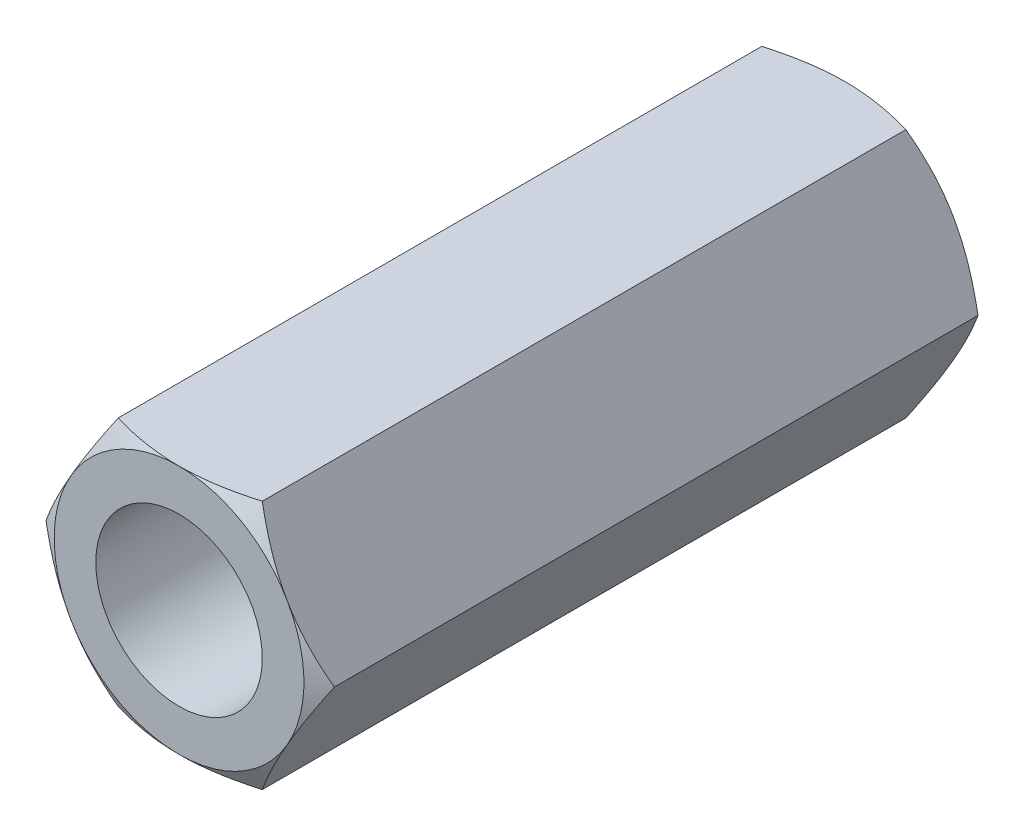
ISO-10303-21;
HEADER;
FILE_DESCRIPTION(('STEP AP214'),'2;1');
FILE_NAME('part.step','',(''),(''),'','','');
FILE_SCHEMA(('AUTOMOTIVE_DESIGN { 1 0 10303 214 1 1 1 1 }'));
ENDSEC;
DATA;
#1=APPLICATION_CONTEXT('core data for automotive mechanical design processes');
#2=APPLICATION_PROTOCOL_DEFINITION('international standard','automotive_design',2000,#1);
#3=PRODUCT_CONTEXT('',#1,'mechanical');
#4=PRODUCT('Part','Part','',(#3));
#5=PRODUCT_RELATED_PRODUCT_CATEGORY('part','',(#4));
#6=PRODUCT_DEFINITION_FORMATION('','',#4);
#7=PRODUCT_DEFINITION_CONTEXT('part definition',#1,'design');
#8=PRODUCT_DEFINITION('design','',#6,#7);
#9=PRODUCT_DEFINITION_SHAPE('','',#8);
#10=(LENGTH_UNIT() NAMED_UNIT(*) SI_UNIT(.MILLI.,.METRE.));
#11=(NAMED_UNIT(*) PLANE_ANGLE_UNIT() SI_UNIT($,.RADIAN.));
#12=(NAMED_UNIT(*) SI_UNIT($,.STERADIAN.) SOLID_ANGLE_UNIT());
#13=UNCERTAINTY_MEASURE_WITH_UNIT(LENGTH_MEASURE(1.E-05),#10,'distance_accuracy_value','');
#14=(GEOMETRIC_REPRESENTATION_CONTEXT(3) GLOBAL_UNCERTAINTY_ASSIGNED_CONTEXT((#13)) GLOBAL_UNIT_ASSIGNED_CONTEXT((#10,
#11,#12)) REPRESENTATION_CONTEXT('',''));
#15=CARTESIAN_POINT('',(0.,0.,0.));
#16=DIRECTION('',(0.,0.,1.));
#17=DIRECTION('',(1.,0.,0.));
#18=AXIS2_PLACEMENT_3D('',#15,#16,#17);
#19=CARTESIAN_POINT('',(0.,0.,7.56698729810778));
#20=DIRECTION('',(0.,0.,-1.));
#21=DIRECTION('',(0.,1.,0.));
#22=AXIS2_PLACEMENT_3D('',#19,#20,#21);
#23=CONICAL_SURFACE('',#22,3.75,1.0471975511966);
#24=CARTESIAN_POINT('',(-4.61658816560314,-3.,6.55332536641131));
#25=CARTESIAN_POINT('',(-4.48585639553745,-3.,6.61659673599051));
#26=CARTESIAN_POINT('',(-4.35482063299639,-3.,6.67925095047082));
#27=CARTESIAN_POINT('',(-4.09197932362655,-3.,6.80297722697862));
#28=CARTESIAN_POINT('',(-3.96017365610343,-3.,6.86404903231273));
#29=CARTESIAN_POINT('',(-3.69493421662757,-3.,6.98457763911744));
#30=CARTESIAN_POINT('',(-3.56149546306723,-3.,7.04402351646837));
#31=CARTESIAN_POINT('',(-3.29354397999658,-3.,7.16043407504241));
#32=CARTESIAN_POINT('',(-3.15903130268234,-3.,7.21739887599533));
#33=CARTESIAN_POINT('',(-2.88451486663867,-3.,7.32991377331615));
#34=CARTESIAN_POINT('',(-2.74447033709531,-3.,7.38536494839728));
#35=CARTESIAN_POINT('',(-2.46272959449536,-3.,7.49198287179878));
#36=CARTESIAN_POINT('',(-2.32103319621333,-3.,7.54314913428037));
#37=CARTESIAN_POINT('',(-2.03604039609872,-3.,7.63982761977302));
#38=CARTESIAN_POINT('',(-1.89274802630187,-3.,7.68535160726105));
#39=CARTESIAN_POINT('',(-1.60410836835444,-3.,7.76926106967255));
#40=CARTESIAN_POINT('',(-1.4587617546537,-3.,7.8076488315534));
#41=CARTESIAN_POINT('',(-1.16673215848061,-3.,7.8752176455911));
#42=CARTESIAN_POINT('',(-1.0200606408196,-3.,7.90444732518244));
#43=CARTESIAN_POINT('',(-0.724931883390046,-3.,7.95202353955565));
#44=CARTESIAN_POINT('',(-0.57647480215395,-3.,7.97037103334759));
#45=CARTESIAN_POINT('',(-0.280440052185821,-3.,7.99447833561648));
#46=CARTESIAN_POINT('',(-0.132875652708779,-3.,8.00039709755714));
#47=CARTESIAN_POINT('',(0.162228239904157,-3.,7.99956145014694));
#48=CARTESIAN_POINT('',(0.309767732325291,-3.,7.99280672401251));
#49=CARTESIAN_POINT('',(0.561328059626861,-3.,7.9709572819287));
#50=CARTESIAN_POINT('',(0.665621803419396,-3.,7.95883150506769));
#51=CARTESIAN_POINT('',(0.873419518980608,-3.,7.92902216036775));
#52=CARTESIAN_POINT('',(0.976923376822562,-3.,7.91133780576261));
#53=CARTESIAN_POINT('',(1.28611373532514,-3.,7.85087645938643));
#54=CARTESIAN_POINT('',(1.49035730083079,-3.,7.80070312750081));
#55=CARTESIAN_POINT('',(1.89902764143582,-3.,7.68479281504696));
#56=CARTESIAN_POINT('',(2.10336150492194,-3.,7.61874063547991));
#57=CARTESIAN_POINT('',(2.40703442855808,-3.,7.51188270244431));
#58=CARTESIAN_POINT('',(2.50777604457203,-3.,7.47497145514699));
#59=CARTESIAN_POINT('',(2.70843244292279,-3.,7.39896563915211));
#60=CARTESIAN_POINT('',(2.80834723318006,-3.,7.35987109139702));
#61=CARTESIAN_POINT('',(3.03652654486057,-3.,7.26818150264062));
#62=CARTESIAN_POINT('',(3.16454614650238,-3.,7.21497889029494));
#63=CARTESIAN_POINT('',(3.4195550326144,-3.,7.10615379179428));
#64=CARTESIAN_POINT('',(3.54654426752982,-3.,7.05053119006049));
#65=CARTESIAN_POINT('',(3.9262586042304,-3.,6.88075275505402));
#66=CARTESIAN_POINT('',(4.17768851165821,-3.,6.76370348434465));
#67=CARTESIAN_POINT('',(4.67831517527856,-3.,6.52440154372504));
#68=CARTESIAN_POINT('',(4.92750969345665,-3.,6.40214424003166));
#69=CARTESIAN_POINT('',(5.42413001849476,-3.,6.15407673717374));
#70=CARTESIAN_POINT('',(5.67155576558937,-3.,6.02826641865999));
#71=CARTESIAN_POINT('',(6.14562883300115,-3.,5.78413020470004));
#72=CARTESIAN_POINT('',(6.3723756003469,-3.,5.66599677644138));
#73=CARTESIAN_POINT('',(6.82501767517009,-3.,5.42809509619585));
#74=CARTESIAN_POINT('',(7.05091295673014,-3.,5.30832679495164));
#75=CARTESIAN_POINT('',(7.50152538445931,-3.,5.06780728554477));
#76=CARTESIAN_POINT('',(7.72624403806942,-3.,4.94705889743175));
#77=CARTESIAN_POINT('',(8.17513206085803,-3.,4.70457171012414));
#78=CARTESIAN_POINT('',(8.3993014569565,-3.,4.58283296078537));
#79=CARTESIAN_POINT('',(8.62326645922437,-3.,4.46072192935785));
#80=B_SPLINE_CURVE_WITH_KNOTS('',3,(#24,#25,#26,#27,#28,#29,#30,#31,#32,#33,#34,#35,#36,#37,#38,
#39,#40,#41,#42,#43,#44,#45,#46,#47,#48,#49,#50,#51,#52,#53,#54,#55,#56,#57,#58,#59,#60,#61,#62,
#63,#64,#65,#66,#67,#68,#69,#70,#71,#72,#73,#74,#75,#76,#77,#78,#79),.UNSPECIFIED.,.F.,.F.,(4,2,
2,2,2,2,2,2,2,2,2,2,2,2,2,2,2,2,2,2,2,2,2,2,2,2,2,4),(0.,0.435719350665182,0.871508945355478,
1.30973230306221,1.74793448985021,2.19974947235604,2.65161561410331,3.10252314515071,
3.55328592310448,4.00161301376219,4.4499005890032,4.8924191110649,5.33494869436421,
5.64978531479407,5.96466651757124,6.59479413668654,7.2386470362871,7.56049974594028,
7.88234936887596,8.29822097415706,8.71411246333824,9.54603104088751,10.3787059339167,
11.2114088306492,11.9784254401204,12.7454652103875,13.5107780415065,14.2760525814872),.UNSPECIFIED.);
#81=CARTESIAN_POINT('',(1.73205080756888,-3.,7.73205080756888));
#82=VERTEX_POINT('',#81);
#83=CARTESIAN_POINT('',(0.,-3.,8.));
#84=VERTEX_POINT('',#83);
#85=EDGE_CURVE('E227',#82,#84,#80,.F.);
#86=ORIENTED_EDGE('',*,*,#85,.F.);
#87=CARTESIAN_POINT('',(3.46421708519159,0.000199999999999775,7.73198413756899));
#88=CARTESIAN_POINT('',(3.38810199317915,-0.131635206588333,7.77594629554769));
#89=CARTESIAN_POINT('',(3.31132988107606,-0.26460840535525,7.81592841370737));
#90=CARTESIAN_POINT('',(3.15645624025988,-0.532857420002057,7.88571791955454));
#91=CARTESIAN_POINT('',(3.078351959461,-0.668138002634343,7.91550061773462));
#92=CARTESIAN_POINT('',(2.92311136358059,-0.937022602096485,7.96186216078875));
#93=CARTESIAN_POINT('',(2.84599893549861,-1.07058524542946,7.97874955887705));
#94=CARTESIAN_POINT('',(2.6914112001411,-1.33833905729569,7.99891035755148));
#95=CARTESIAN_POINT('',(2.61393645482892,-1.47252925247985,8.00220045221892));
#96=CARTESIAN_POINT('',(2.46916798492017,-1.72327559769581,7.99535946911461));
#97=CARTESIAN_POINT('',(2.40185259973206,-1.83986926497268,7.98690808580738));
#98=CARTESIAN_POINT('',(2.2676603930218,-2.07229698497464,7.96012105699297));
#99=CARTESIAN_POINT('',(2.2007840357172,-2.18813023365133,7.94177625913829));
#100=CARTESIAN_POINT('',(2.06631510305815,-2.42103725705637,7.89591524914667));
#101=CARTESIAN_POINT('',(1.99873954872331,-2.53808155051394,7.86820461473692));
#102=CARTESIAN_POINT('',(1.86459637060759,-2.77042435049913,7.8053122048626));
#103=CARTESIAN_POINT('',(1.79802702797161,-2.88572583417111,7.77014520897844));
#104=CARTESIAN_POINT('',(1.73193533751504,-3.0002,7.73198413756899));
#105=B_SPLINE_CURVE_WITH_KNOTS('',3,(#87,#88,#89,#90,#91,#92,#93,#94,#95,#96,#97,#98,#99,#100,
#101,#102,#103,#104),.UNSPECIFIED.,.F.,.F.,(4,2,2,2,2,2,2,2,4),(0.,0.475539830103042,
0.952222784107966,1.41710776961288,1.88142182298026,2.28572436316091,2.69040156475039,
3.10405572063576,3.5168974940707),.UNSPECIFIED.);
#106=CARTESIAN_POINT('',(2.59807621135331,-1.5,8.));
#107=VERTEX_POINT('',#106);
#108=EDGE_CURVE('E156',#107,#82,#105,.T.);
#109=ORIENTED_EDGE('',*,*,#108,.F.);
#110=CARTESIAN_POINT('',(0.,0.,8.));
#111=DIRECTION('',(0.,0.,1.));
#112=DIRECTION('',(0.,-1.,0.));
#113=AXIS2_PLACEMENT_3D('',#110,#111,#112);
#114=CIRCLE('',#113,3.);
#115=EDGE_CURVE('E12',#84,#107,#114,.T.);
#116=ORIENTED_EDGE('',*,*,#115,.F.);
#117=EDGE_LOOP('',(#86,#109,#116));
#118=FACE_BOUND('',#117,.T.);
#119=ADVANCED_FACE('F37',(#118),#23,.T.);
#120=CARTESIAN_POINT('',(-1.73205080756888,-3.,7.73205080756888));
#121=VERTEX_POINT('',#120);
#122=EDGE_CURVE('E232',#84,#121,#80,.F.);
#123=ORIENTED_EDGE('',*,*,#122,.F.);
#124=CARTESIAN_POINT('',(-2.59807621135332,-1.5,8.));
#125=VERTEX_POINT('',#124);
#126=EDGE_CURVE('E46',#125,#84,#114,.T.);
#127=ORIENTED_EDGE('',*,*,#126,.F.);
#128=CARTESIAN_POINT('',(-1.73193533751504,-3.0002,7.73198413756899));
#129=CARTESIAN_POINT('',(-1.80805042952748,-2.86836479341167,7.77594629554769));
#130=CARTESIAN_POINT('',(-1.88482254163057,-2.73539159464475,7.81592841370737));
#131=CARTESIAN_POINT('',(-2.03969618244675,-2.46714257999794,7.88571791955454));
#132=CARTESIAN_POINT('',(-2.11780046324563,-2.33186199736566,7.91550061773462));
#133=CARTESIAN_POINT('',(-2.27304105912605,-2.06297739790352,7.96186216078875));
#134=CARTESIAN_POINT('',(-2.35015348720802,-1.92941475457054,7.97874955887705));
#135=CARTESIAN_POINT('',(-2.50474122256554,-1.66166094270431,7.99891035755148));
#136=CARTESIAN_POINT('',(-2.58221596787771,-1.52747074752016,8.00220045221892));
#137=CARTESIAN_POINT('',(-2.72698443778647,-1.27672440230419,7.99535946911461));
#138=CARTESIAN_POINT('',(-2.79429982297457,-1.16013073502732,7.98690808580738));
#139=CARTESIAN_POINT('',(-2.92849202968483,-0.927703015025363,7.96012105699297));
#140=CARTESIAN_POINT('',(-2.99536838698943,-0.811869766348669,7.94177625913829));
#141=CARTESIAN_POINT('',(-3.12983731964849,-0.578962742943632,7.89591524914667));
#142=CARTESIAN_POINT('',(-3.19741287398332,-0.461918449486059,7.86820461473692));
#143=CARTESIAN_POINT('',(-3.33155605209904,-0.229575649500875,7.8053122048626));
#144=CARTESIAN_POINT('',(-3.39812539473502,-0.114274165828894,7.77014520897844));
#145=CARTESIAN_POINT('',(-3.46421708519159,0.00019999999999953,7.73198413756899));
#146=B_SPLINE_CURVE_WITH_KNOTS('',3,(#128,#129,#130,#131,#132,#133,#134,#135,#136,#137,#138,
#139,#140,#141,#142,#143,#144,#145),.UNSPECIFIED.,.F.,.F.,(4,2,2,2,2,2,2,2,4),(0.,
0.475539830103042,0.952222784107965,1.41710776961288,1.88142182298026,2.28572436316091,
2.69040156475039,3.10405572063576,3.5168974940707),.UNSPECIFIED.);
#147=EDGE_CURVE('E273',#121,#125,#146,.T.);
#148=ORIENTED_EDGE('',*,*,#147,.F.);
#149=EDGE_LOOP('',(#123,#127,#148));
#150=FACE_BOUND('',#149,.T.);
#151=ADVANCED_FACE('F248',(#150),#23,.T.);
#152=CARTESIAN_POINT('',(-3.46410161513775,0.,7.73205080756888));
#153=VERTEX_POINT('',#152);
#154=EDGE_CURVE('E268',#125,#153,#146,.T.);
#155=ORIENTED_EDGE('',*,*,#154,.F.);
#156=CARTESIAN_POINT('',(-2.59807621135332,1.5,8.));
#157=VERTEX_POINT('',#156);
#158=EDGE_CURVE('E223',#157,#125,#114,.T.);
#159=ORIENTED_EDGE('',*,*,#158,.F.);
#160=CARTESIAN_POINT('',(-3.46421708519159,-0.000200000000000177,7.73198413756899));
#161=CARTESIAN_POINT('',(-3.38810199317915,0.131635206588331,7.77594629554769));
#162=CARTESIAN_POINT('',(-3.31132988107606,0.264608405355249,7.81592841370737));
#163=CARTESIAN_POINT('',(-3.15645624025988,0.532857420002056,7.88571791955453));
#164=CARTESIAN_POINT('',(-3.078351959461,0.668138002634342,7.91550061773462));
#165=CARTESIAN_POINT('',(-2.92311136358059,0.937022602096484,7.96186216078874));
#166=CARTESIAN_POINT('',(-2.84599893549861,1.07058524542946,7.97874955887705));
#167=CARTESIAN_POINT('',(-2.6914112001411,1.33833905729569,7.99891035755148));
#168=CARTESIAN_POINT('',(-2.61393645482892,1.47252925247985,8.00220045221892));
#169=CARTESIAN_POINT('',(-2.46916798492017,1.72327559769581,7.99535946911461));
#170=CARTESIAN_POINT('',(-2.40185259973206,1.83986926497268,7.98690808580738));
#171=CARTESIAN_POINT('',(-2.2676603930218,2.07229698497464,7.96012105699296));
#172=CARTESIAN_POINT('',(-2.2007840357172,2.18813023365133,7.94177625913829));
#173=CARTESIAN_POINT('',(-2.06631510305815,2.42103725705637,7.89591524914667));
#174=CARTESIAN_POINT('',(-1.99873954872331,2.53808155051394,7.86820461473692));
#175=CARTESIAN_POINT('',(-1.86459637060759,2.77042435049913,7.8053122048626));
#176=CARTESIAN_POINT('',(-1.79802702797161,2.88572583417111,7.77014520897844));
#177=CARTESIAN_POINT('',(-1.73193533751504,3.0002,7.73198413756899));
#178=B_SPLINE_CURVE_WITH_KNOTS('',3,(#160,#161,#162,#163,#164,#165,#166,#167,#168,#169,#170,
#171,#172,#173,#174,#175,#176,#177),.UNSPECIFIED.,.F.,.F.,(4,2,2,2,2,2,2,2,4),(0.,
0.47553983010304,0.952222784107965,1.41710776961288,1.88142182298026,2.28572436316091,
2.69040156475039,3.10405572063576,3.5168974940707),.UNSPECIFIED.);
#179=EDGE_CURVE('E334',#153,#157,#178,.T.);
#180=ORIENTED_EDGE('',*,*,#179,.F.);
#181=EDGE_LOOP('',(#155,#159,#180));
#182=FACE_BOUND('',#181,.T.);
#183=ADVANCED_FACE('F333',(#182),#23,.T.);
#184=CARTESIAN_POINT('',(-1.73205080756888,3.,7.73205080756888));
#185=VERTEX_POINT('',#184);
#186=EDGE_CURVE('E263',#157,#185,#178,.T.);
#187=ORIENTED_EDGE('',*,*,#186,.F.);
#188=CARTESIAN_POINT('',(0.,3.,8.));
#189=VERTEX_POINT('',#188);
#190=EDGE_CURVE('E322',#189,#157,#114,.T.);
#191=ORIENTED_EDGE('',*,*,#190,.F.);
#192=CARTESIAN_POINT('',(-4.61658816560314,3.,6.55332536641131));
#193=CARTESIAN_POINT('',(-4.48585639553746,3.,6.61659673599051));
#194=CARTESIAN_POINT('',(-4.35482063299639,3.,6.67925095047082));
#195=CARTESIAN_POINT('',(-4.09197932362655,3.,6.80297722697861));
#196=CARTESIAN_POINT('',(-3.96017365610343,3.,6.86404903231273));
#197=CARTESIAN_POINT('',(-3.69493421662757,3.,6.98457763911744));
#198=CARTESIAN_POINT('',(-3.56149546306723,3.,7.04402351646837));
#199=CARTESIAN_POINT('',(-3.29354397999658,3.,7.16043407504241));
#200=CARTESIAN_POINT('',(-3.15903130268234,3.,7.21739887599533));
#201=CARTESIAN_POINT('',(-2.88451486663867,3.,7.32991377331615));
#202=CARTESIAN_POINT('',(-2.74447033709531,3.,7.38536494839728));
#203=CARTESIAN_POINT('',(-2.46272959449536,3.,7.49198287179878));
#204=CARTESIAN_POINT('',(-2.32103319621333,3.,7.54314913428037));
#205=CARTESIAN_POINT('',(-2.03604039609872,3.,7.63982761977302));
#206=CARTESIAN_POINT('',(-1.89274802630187,3.,7.68535160726105));
#207=CARTESIAN_POINT('',(-1.60410836835443,3.,7.76926106967255));
#208=CARTESIAN_POINT('',(-1.45876175465369,3.,7.8076488315534));
#209=CARTESIAN_POINT('',(-1.16673215848061,3.,7.8752176455911));
#210=CARTESIAN_POINT('',(-1.0200606408196,3.,7.90444732518244));
#211=CARTESIAN_POINT('',(-0.724931883390044,3.,7.95202353955565));
#212=CARTESIAN_POINT('',(-0.576474802153949,3.,7.97037103334759));
#213=CARTESIAN_POINT('',(-0.280440052185819,3.,7.99447833561648));
#214=CARTESIAN_POINT('',(-0.132875652708777,3.,8.00039709755714));
#215=CARTESIAN_POINT('',(0.162228239904159,3.,7.99956145014694));
#216=CARTESIAN_POINT('',(0.309767732325292,3.,7.99280672401251));
#217=CARTESIAN_POINT('',(0.561328059626863,3.,7.97095728192869));
#218=CARTESIAN_POINT('',(0.665621803419398,3.,7.95883150506769));
#219=CARTESIAN_POINT('',(0.873419518980611,3.,7.92902216036775));
#220=CARTESIAN_POINT('',(0.976923376822566,3.,7.9113378057626));
#221=CARTESIAN_POINT('',(1.28611373532515,3.,7.85087645938643));
#222=CARTESIAN_POINT('',(1.49035730083079,3.,7.80070312750081));
#223=CARTESIAN_POINT('',(1.89902764143582,3.,7.68479281504695));
#224=CARTESIAN_POINT('',(2.10336150492195,3.,7.6187406354799));
#225=CARTESIAN_POINT('',(2.40703442855808,3.,7.5118827024443));
#226=CARTESIAN_POINT('',(2.50777604457204,3.,7.47497145514699));
#227=CARTESIAN_POINT('',(2.7084324429228,3.,7.39896563915211));
#228=CARTESIAN_POINT('',(2.80834723318007,3.,7.35987109139702));
#229=CARTESIAN_POINT('',(3.03652654486058,3.,7.26818150264061));
#230=CARTESIAN_POINT('',(3.16454614650239,3.,7.21497889029493));
#231=CARTESIAN_POINT('',(3.41955503261441,3.,7.10615379179428));
#232=CARTESIAN_POINT('',(3.54654426752983,3.,7.05053119006048));
#233=CARTESIAN_POINT('',(3.92625860423041,3.,6.88075275505402));
#234=CARTESIAN_POINT('',(4.17768851165822,3.,6.76370348434465));
#235=CARTESIAN_POINT('',(4.67831517527856,3.,6.52440154372503));
#236=CARTESIAN_POINT('',(4.92750969345666,3.,6.40214424003165));
#237=CARTESIAN_POINT('',(5.42413001849477,3.,6.15407673717374));
#238=CARTESIAN_POINT('',(5.67155576558937,3.,6.02826641865999));
#239=CARTESIAN_POINT('',(6.14562883300115,3.,5.78413020470004));
#240=CARTESIAN_POINT('',(6.37237560034691,3.,5.66599677644137));
#241=CARTESIAN_POINT('',(6.8250176751701,3.,5.42809509619584));
#242=CARTESIAN_POINT('',(7.05091295673014,3.,5.30832679495164));
#243=CARTESIAN_POINT('',(7.50152538445931,3.,5.06780728554477));
#244=CARTESIAN_POINT('',(7.72624403806943,3.,4.94705889743175));
#245=CARTESIAN_POINT('',(8.17513206085803,3.,4.70457171012414));
#246=CARTESIAN_POINT('',(8.3993014569565,3.,4.58283296078537));
#247=CARTESIAN_POINT('',(8.62326645922438,3.,4.46072192935785));
#248=B_SPLINE_CURVE_WITH_KNOTS('',3,(#192,#193,#194,#195,#196,#197,#198,#199,#200,#201,#202,
#203,#204,#205,#206,#207,#208,#209,#210,#211,#212,#213,#214,#215,#216,#217,#218,#219,#220,#221,
#222,#223,#224,#225,#226,#227,#228,#229,#230,#231,#232,#233,#234,#235,#236,#237,#238,#239,#240,
#241,#242,#243,#244,#245,#246,#247),.UNSPECIFIED.,.F.,.F.,(4,2,2,2,2,2,2,2,2,2,2,2,2,2,2,2,2,2,
2,2,2,2,2,2,2,2,2,4),(0.,0.435719350665182,0.871508945355478,1.30973230306221,1.74793448985021,
2.19974947235604,2.65161561410331,3.10252314515072,3.55328592310448,4.00161301376219,
4.4499005890032,4.89241911106491,5.33494869436421,5.64978531479407,5.96466651757125,
6.59479413668655,7.23864703628711,7.56049974594029,7.88234936887597,8.29822097415706,
8.71411246333825,9.54603104088751,10.3787059339167,11.2114088306492,11.9784254401204,
12.7454652103875,13.5107780415065,14.2760525814872),.UNSPECIFIED.);
#249=EDGE_CURVE('E295',#185,#189,#248,.T.);
#250=ORIENTED_EDGE('',*,*,#249,.F.);
#251=EDGE_LOOP('',(#187,#191,#250));
#252=FACE_BOUND('',#251,.T.);
#253=ADVANCED_FACE('F337',(#252),#23,.T.);
#254=CARTESIAN_POINT('',(1.73205080756888,3.,7.73205080756888));
#255=VERTEX_POINT('',#254);
#256=EDGE_CURVE('E257',#189,#255,#248,.T.);
#257=ORIENTED_EDGE('',*,*,#256,.F.);
#258=CARTESIAN_POINT('',(2.59807621135332,1.5,8.));
#259=VERTEX_POINT('',#258);
#260=EDGE_CURVE('E317',#259,#189,#114,.T.);
#261=ORIENTED_EDGE('',*,*,#260,.F.);
#262=CARTESIAN_POINT('',(1.73193533751504,3.0002,7.73198413756899));
#263=CARTESIAN_POINT('',(1.80805042952748,2.86836479341167,7.77594629554769));
#264=CARTESIAN_POINT('',(1.88482254163057,2.73539159464475,7.81592841370737));
#265=CARTESIAN_POINT('',(2.03969618244675,2.46714257999794,7.88571791955453));
#266=CARTESIAN_POINT('',(2.11780046324563,2.33186199736566,7.91550061773462));
#267=CARTESIAN_POINT('',(2.27304105912605,2.06297739790352,7.96186216078874));
#268=CARTESIAN_POINT('',(2.35015348720802,1.92941475457054,7.97874955887705));
#269=CARTESIAN_POINT('',(2.50474122256554,1.66166094270431,7.99891035755148));
#270=CARTESIAN_POINT('',(2.58221596787771,1.52747074752015,8.00220045221892));
#271=CARTESIAN_POINT('',(2.72698443778647,1.27672440230419,7.99535946911461));
#272=CARTESIAN_POINT('',(2.79429982297457,1.16013073502732,7.98690808580738));
#273=CARTESIAN_POINT('',(2.92849202968483,0.927703015025362,7.96012105699297));
#274=CARTESIAN_POINT('',(2.99536838698943,0.811869766348667,7.94177625913829));
#275=CARTESIAN_POINT('',(3.12983731964849,0.578962742943631,7.89591524914667));
#276=CARTESIAN_POINT('',(3.19741287398332,0.461918449486058,7.86820461473692));
#277=CARTESIAN_POINT('',(3.33155605209904,0.229575649500874,7.8053122048626));
#278=CARTESIAN_POINT('',(3.39812539473502,0.114274165828893,7.77014520897844));
#279=CARTESIAN_POINT('',(3.46421708519159,-0.000200000000000686,7.73198413756899));
#280=B_SPLINE_CURVE_WITH_KNOTS('',3,(#262,#263,#264,#265,#266,#267,#268,#269,#270,#271,#272,
#273,#274,#275,#276,#277,#278,#279),.UNSPECIFIED.,.F.,.F.,(4,2,2,2,2,2,2,2,4),(0.,
0.475539830103041,0.952222784107966,1.41710776961288,1.88142182298026,2.28572436316091,
2.69040156475039,3.10405572063576,3.5168974940707),.UNSPECIFIED.);
#281=EDGE_CURVE('E148',#255,#259,#280,.T.);
#282=ORIENTED_EDGE('',*,*,#281,.F.);
#283=EDGE_LOOP('',(#257,#261,#282));
#284=FACE_BOUND('',#283,.T.);
#285=ADVANCED_FACE('F318',(#284),#23,.T.);
#286=CARTESIAN_POINT('',(3.46410161513775,0.,7.73205080756888));
#287=VERTEX_POINT('',#286);
#288=EDGE_CURVE('E140',#259,#287,#280,.T.);
#289=ORIENTED_EDGE('',*,*,#288,.F.);
#290=EDGE_CURVE('E45',#107,#259,#114,.T.);
#291=ORIENTED_EDGE('',*,*,#290,.F.);
#292=EDGE_CURVE('E53',#287,#107,#105,.T.);
#293=ORIENTED_EDGE('',*,*,#292,.F.);
#294=EDGE_LOOP('',(#289,#291,#293));
#295=FACE_BOUND('',#294,.T.);
#296=ADVANCED_FACE('F250',(#295),#23,.T.);
#297=CARTESIAN_POINT('',(0.,0.,8.));
#298=DIRECTION('',(0.,0.,-1.));
#299=DIRECTION('',(0.,1.,0.));
#300=AXIS2_PLACEMENT_3D('',#297,#298,#299);
#301=PLANE('',#300);
#302=CARTESIAN_POINT('',(0.,0.,8.));
#303=DIRECTION('',(0.,0.,1.));
#304=DIRECTION('',(1.,0.,0.));
#305=AXIS2_PLACEMENT_3D('',#302,#303,#304);
#306=CIRCLE('',#305,2.);
#307=CARTESIAN_POINT('',(2.,0.,8.));
#308=VERTEX_POINT('',#307);
#309=EDGE_CURVE('E187',#308,#308,#306,.T.);
#310=ORIENTED_EDGE('',*,*,#309,.F.);
#311=EDGE_LOOP('',(#310));
#312=FACE_BOUND('',#311,.T.);
#313=ORIENTED_EDGE('',*,*,#115,.T.);
#314=ORIENTED_EDGE('',*,*,#290,.T.);
#315=ORIENTED_EDGE('',*,*,#260,.T.);
#316=ORIENTED_EDGE('',*,*,#190,.T.);
#317=ORIENTED_EDGE('',*,*,#158,.T.);
#318=ORIENTED_EDGE('',*,*,#126,.T.);
#319=EDGE_LOOP('',(#313,#314,#315,#316,#317,#318));
#320=FACE_BOUND('',#319,.T.);
#321=ADVANCED_FACE('F39',(#312,#320),#301,.F.);
#322=CARTESIAN_POINT('',(-1.73205080756888,-3.,-8.));
#323=DIRECTION('',(0.,-1.,0.));
#324=DIRECTION('',(1.,0.,0.));
#325=AXIS2_PLACEMENT_3D('',#322,#323,#324);
#326=PLANE('',#325);
#327=ORIENTED_EDGE('',*,*,#85,.T.);
#328=ORIENTED_EDGE('',*,*,#122,.T.);
#329=DIRECTION('',(0.,0.,1.));
#330=VECTOR('',#329,1.);
#331=CARTESIAN_POINT('',(-1.73205080756888,-3.,-8.));
#332=LINE('',#331,#330);
#333=CARTESIAN_POINT('',(-1.73205080756888,-3.,-7.73205080756888));
#334=VERTEX_POINT('',#333);
#335=EDGE_CURVE('E133',#334,#121,#332,.T.);
#336=ORIENTED_EDGE('',*,*,#335,.F.);
#337=CARTESIAN_POINT('',(-4.61658816560314,-3.,-6.55332536641131));
#338=CARTESIAN_POINT('',(-4.48585639553745,-3.,-6.61659673599051));
#339=CARTESIAN_POINT('',(-4.35482063299639,-3.,-6.67925095047082));
#340=CARTESIAN_POINT('',(-4.09197932362655,-3.,-6.80297722697861));
#341=CARTESIAN_POINT('',(-3.96017365610343,-3.,-6.86404903231273));
#342=CARTESIAN_POINT('',(-3.69493421662757,-3.,-6.98457763911744));
#343=CARTESIAN_POINT('',(-3.56149546306723,-3.,-7.04402351646837));
#344=CARTESIAN_POINT('',(-3.29354397999658,-3.,-7.16043407504241));
#345=CARTESIAN_POINT('',(-3.15903130268234,-3.,-7.21739887599533));
#346=CARTESIAN_POINT('',(-2.88451486663867,-3.,-7.32991377331615));
#347=CARTESIAN_POINT('',(-2.74447033709531,-3.,-7.38536494839728));
#348=CARTESIAN_POINT('',(-2.46272959449536,-3.,-7.49198287179878));
#349=CARTESIAN_POINT('',(-2.32103319621333,-3.,-7.54314913428036));
#350=CARTESIAN_POINT('',(-2.03604039609872,-3.,-7.63982761977302));
#351=CARTESIAN_POINT('',(-1.89274802630187,-3.,-7.68535160726104));
#352=CARTESIAN_POINT('',(-1.60410836835444,-3.,-7.76926106967255));
#353=CARTESIAN_POINT('',(-1.4587617546537,-3.,-7.8076488315534));
#354=CARTESIAN_POINT('',(-1.16673215848061,-3.,-7.8752176455911));
#355=CARTESIAN_POINT('',(-1.0200606408196,-3.,-7.90444732518244));
#356=CARTESIAN_POINT('',(-0.724931883390046,-3.,-7.95202353955565));
#357=CARTESIAN_POINT('',(-0.57647480215395,-3.,-7.97037103334759));
#358=CARTESIAN_POINT('',(-0.280440052185821,-3.,-7.99447833561648));
#359=CARTESIAN_POINT('',(-0.132875652708779,-3.,-8.00039709755714));
#360=CARTESIAN_POINT('',(0.162228239904157,-3.,-7.99956145014694));
#361=CARTESIAN_POINT('',(0.309767732325291,-3.,-7.99280672401251));
#362=CARTESIAN_POINT('',(0.561328059626861,-3.,-7.9709572819287));
#363=CARTESIAN_POINT('',(0.665621803419396,-3.,-7.95883150506769));
#364=CARTESIAN_POINT('',(0.873419518980609,-3.,-7.92902216036775));
#365=CARTESIAN_POINT('',(0.976923376822563,-3.,-7.9113378057626));
#366=CARTESIAN_POINT('',(1.28611373532515,-3.,-7.85087645938643));
#367=CARTESIAN_POINT('',(1.49035730083079,-3.,-7.80070312750081));
#368=CARTESIAN_POINT('',(1.89902764143582,-3.,-7.68479281504695));
#369=CARTESIAN_POINT('',(2.10336150492194,-3.,-7.61874063547991));
#370=CARTESIAN_POINT('',(2.40703442855808,-3.,-7.51188270244431));
#371=CARTESIAN_POINT('',(2.50777604457203,-3.,-7.47497145514699));
#372=CARTESIAN_POINT('',(2.7084324429228,-3.,-7.39896563915211));
#373=CARTESIAN_POINT('',(2.80834723318007,-3.,-7.35987109139702));
#374=CARTESIAN_POINT('',(3.03652654486057,-3.,-7.26818150264062));
#375=CARTESIAN_POINT('',(3.16454614650238,-3.,-7.21497889029494));
#376=CARTESIAN_POINT('',(3.41955503261441,-3.,-7.10615379179428));
#377=CARTESIAN_POINT('',(3.54654426752982,-3.,-7.05053119006048));
#378=CARTESIAN_POINT('',(3.92625860423041,-3.,-6.88075275505402));
#379=CARTESIAN_POINT('',(4.17768851165822,-3.,-6.76370348434465));
#380=CARTESIAN_POINT('',(4.67831517527856,-3.,-6.52440154372503));
#381=CARTESIAN_POINT('',(4.92750969345665,-3.,-6.40214424003165));
#382=CARTESIAN_POINT('',(5.42413001849476,-3.,-6.15407673717374));
#383=CARTESIAN_POINT('',(5.67155576558937,-3.,-6.02826641865999));
#384=CARTESIAN_POINT('',(6.14562883300115,-3.,-5.78413020470004));
#385=CARTESIAN_POINT('',(6.37237560034691,-3.,-5.66599677644137));
#386=CARTESIAN_POINT('',(6.82501767517009,-3.,-5.42809509619584));
#387=CARTESIAN_POINT('',(7.05091295673014,-3.,-5.30832679495164));
#388=CARTESIAN_POINT('',(7.50152538445931,-3.,-5.06780728554477));
#389=CARTESIAN_POINT('',(7.72624403806943,-3.,-4.94705889743175));
#390=CARTESIAN_POINT('',(8.17513206085803,-3.,-4.70457171012414));
#391=CARTESIAN_POINT('',(8.3993014569565,-3.,-4.58283296078537));
#392=CARTESIAN_POINT('',(8.62326645922438,-3.,-4.46072192935785));
#393=B_SPLINE_CURVE_WITH_KNOTS('',3,(#337,#338,#339,#340,#341,#342,#343,#344,#345,#346,#347,
#348,#349,#350,#351,#352,#353,#354,#355,#356,#357,#358,#359,#360,#361,#362,#363,#364,#365,#366,
#367,#368,#369,#370,#371,#372,#373,#374,#375,#376,#377,#378,#379,#380,#381,#382,#383,#384,#385,
#386,#387,#388,#389,#390,#391,#392),.UNSPECIFIED.,.F.,.F.,(4,2,2,2,2,2,2,2,2,2,2,2,2,2,2,2,2,2,
2,2,2,2,2,2,2,2,2,4),(0.,0.435719350665182,0.871508945355477,1.30973230306221,1.74793448985021,
2.19974947235604,2.65161561410331,3.10252314515072,3.55328592310448,4.00161301376219,
4.4499005890032,4.8924191110649,5.33494869436421,5.64978531479407,5.96466651757124,
6.59479413668655,7.2386470362871,7.56049974594029,7.88234936887597,8.29822097415706,
8.71411246333825,9.54603104088751,10.3787059339167,11.2114088306492,11.9784254401204,
12.7454652103875,13.5107780415065,14.2760525814872),.UNSPECIFIED.);
#394=CARTESIAN_POINT('',(0.,-3.,-8.));
#395=VERTEX_POINT('',#394);
#396=EDGE_CURVE('E236',#334,#395,#393,.T.);
#397=ORIENTED_EDGE('',*,*,#396,.T.);
#398=CARTESIAN_POINT('',(1.73205080756888,-3.,-7.73205080756888));
#399=VERTEX_POINT('',#398);
#400=EDGE_CURVE('E241',#395,#399,#393,.T.);
#401=ORIENTED_EDGE('',*,*,#400,.T.);
#402=DIRECTION('',(0.,0.,1.));
#403=VECTOR('',#402,1.);
#404=CARTESIAN_POINT('',(1.73205080756888,-3.,-8.));
#405=LINE('',#404,#403);
#406=EDGE_CURVE('E142',#399,#82,#405,.T.);
#407=ORIENTED_EDGE('',*,*,#406,.T.);
#408=EDGE_LOOP('',(#327,#328,#336,#397,#401,#407));
#409=FACE_BOUND('',#408,.T.);
#410=ADVANCED_FACE('F179',(#409),#326,.T.);
#411=CARTESIAN_POINT('',(-3.46410161513775,0.,-8.));
#412=DIRECTION('',(-0.866025403784439,-0.5,0.));
#413=DIRECTION('',(0.5,-0.866025403784439,0.));
#414=AXIS2_PLACEMENT_3D('',#411,#412,#413);
#415=PLANE('',#414);
#416=ORIENTED_EDGE('',*,*,#147,.T.);
#417=ORIENTED_EDGE('',*,*,#154,.T.);
#418=DIRECTION('',(0.,0.,1.));
#419=VECTOR('',#418,1.);
#420=CARTESIAN_POINT('',(-3.46410161513775,0.,-8.));
#421=LINE('',#420,#419);
#422=CARTESIAN_POINT('',(-3.46410161513775,0.,-7.73205080756888));
#423=VERTEX_POINT('',#422);
#424=EDGE_CURVE('E194',#423,#153,#421,.T.);
#425=ORIENTED_EDGE('',*,*,#424,.F.);
#426=CARTESIAN_POINT('',(-3.46421708519159,0.000199999999999904,-7.73198413756899));
#427=CARTESIAN_POINT('',(-3.38810199317915,-0.131635206588332,-7.77594629554769));
#428=CARTESIAN_POINT('',(-3.31132988107606,-0.26460840535525,-7.81592841370737));
#429=CARTESIAN_POINT('',(-3.15645624025988,-0.532857420002056,-7.88571791955453));
#430=CARTESIAN_POINT('',(-3.078351959461,-0.668138002634342,-7.91550061773462));
#431=CARTESIAN_POINT('',(-2.92311136358059,-0.937022602096484,-7.96186216078874));
#432=CARTESIAN_POINT('',(-2.84599893549861,-1.07058524542946,-7.97874955887705));
#433=CARTESIAN_POINT('',(-2.6914112001411,-1.33833905729569,-7.99891035755148));
#434=CARTESIAN_POINT('',(-2.61393645482892,-1.47252925247985,-8.00220045221892));
#435=CARTESIAN_POINT('',(-2.46916798492017,-1.72327559769581,-7.99535946911461));
#436=CARTESIAN_POINT('',(-2.40185259973206,-1.83986926497268,-7.98690808580738));
#437=CARTESIAN_POINT('',(-2.2676603930218,-2.07229698497464,-7.96012105699296));
#438=CARTESIAN_POINT('',(-2.2007840357172,-2.18813023365133,-7.94177625913829));
#439=CARTESIAN_POINT('',(-2.06631510305815,-2.42103725705637,-7.89591524914667));
#440=CARTESIAN_POINT('',(-1.99873954872331,-2.53808155051394,-7.86820461473692));
#441=CARTESIAN_POINT('',(-1.86459637060759,-2.77042435049913,-7.8053122048626));
#442=CARTESIAN_POINT('',(-1.79802702797161,-2.88572583417111,-7.77014520897844));
#443=CARTESIAN_POINT('',(-1.73193533751504,-3.0002,-7.73198413756899));
#444=B_SPLINE_CURVE_WITH_KNOTS('',3,(#426,#427,#428,#429,#430,#431,#432,#433,#434,#435,#436,
#437,#438,#439,#440,#441,#442,#443),.UNSPECIFIED.,.F.,.F.,(4,2,2,2,2,2,2,2,4),(0.,
0.475539830103041,0.952222784107966,1.41710776961288,1.88142182298026,2.28572436316091,
2.69040156475039,3.10405572063576,3.5168974940707),.UNSPECIFIED.);
#445=CARTESIAN_POINT('',(-2.59807621135332,-1.5,-8.));
#446=VERTEX_POINT('',#445);
#447=EDGE_CURVE('E274',#423,#446,#444,.T.);
#448=ORIENTED_EDGE('',*,*,#447,.T.);
#449=EDGE_CURVE('E275',#446,#334,#444,.T.);
#450=ORIENTED_EDGE('',*,*,#449,.T.);
#451=ORIENTED_EDGE('',*,*,#335,.T.);
#452=EDGE_LOOP('',(#416,#417,#425,#448,#450,#451));
#453=FACE_BOUND('',#452,.T.);
#454=ADVANCED_FACE('F279',(#453),#415,.T.);
#455=CARTESIAN_POINT('',(-1.73205080756888,3.,-8.));
#456=DIRECTION('',(-0.866025403784439,0.5,0.));
#457=DIRECTION('',(-0.5,-0.866025403784439,0.));
#458=AXIS2_PLACEMENT_3D('',#455,#456,#457);
#459=PLANE('',#458);
#460=ORIENTED_EDGE('',*,*,#179,.T.);
#461=ORIENTED_EDGE('',*,*,#186,.T.);
#462=DIRECTION('',(0.,0.,1.));
#463=VECTOR('',#462,1.);
#464=CARTESIAN_POINT('',(-1.73205080756888,3.,-8.));
#465=LINE('',#464,#463);
#466=CARTESIAN_POINT('',(-1.73205080756888,3.,-7.73205080756888));
#467=VERTEX_POINT('',#466);
#468=EDGE_CURVE('E191',#467,#185,#465,.T.);
#469=ORIENTED_EDGE('',*,*,#468,.F.);
#470=CARTESIAN_POINT('',(-1.73193533751504,3.0002,-7.73198413756899));
#471=CARTESIAN_POINT('',(-1.80805042952748,2.86836479341167,-7.77594629554769));
#472=CARTESIAN_POINT('',(-1.88482254163057,2.73539159464475,-7.81592841370737));
#473=CARTESIAN_POINT('',(-2.03969618244675,2.46714257999794,-7.88571791955453));
#474=CARTESIAN_POINT('',(-2.11780046324563,2.33186199736566,-7.91550061773462));
#475=CARTESIAN_POINT('',(-2.27304105912605,2.06297739790352,-7.96186216078874));
#476=CARTESIAN_POINT('',(-2.35015348720802,1.92941475457054,-7.97874955887705));
#477=CARTESIAN_POINT('',(-2.50474122256554,1.66166094270431,-7.99891035755148));
#478=CARTESIAN_POINT('',(-2.58221596787771,1.52747074752016,-8.00220045221892));
#479=CARTESIAN_POINT('',(-2.72698443778647,1.27672440230419,-7.99535946911461));
#480=CARTESIAN_POINT('',(-2.79429982297457,1.16013073502732,-7.98690808580738));
#481=CARTESIAN_POINT('',(-2.92849202968483,0.927703015025362,-7.96012105699296));
#482=CARTESIAN_POINT('',(-2.99536838698943,0.811869766348667,-7.94177625913829));
#483=CARTESIAN_POINT('',(-3.12983731964848,0.578962742943631,-7.89591524914667));
#484=CARTESIAN_POINT('',(-3.19741287398332,0.461918449486058,-7.86820461473692));
#485=CARTESIAN_POINT('',(-3.33155605209904,0.229575649500875,-7.8053122048626));
#486=CARTESIAN_POINT('',(-3.39812539473502,0.114274165828893,-7.77014520897844));
#487=CARTESIAN_POINT('',(-3.46421708519159,-0.000200000000000478,-7.73198413756899));
#488=B_SPLINE_CURVE_WITH_KNOTS('',3,(#470,#471,#472,#473,#474,#475,#476,#477,#478,#479,#480,
#481,#482,#483,#484,#485,#486,#487),.UNSPECIFIED.,.F.,.F.,(4,2,2,2,2,2,2,2,4),(0.,
0.47553983010304,0.952222784107965,1.41710776961288,1.88142182298026,2.28572436316091,
2.69040156475039,3.10405572063576,3.5168974940707),.UNSPECIFIED.);
#489=CARTESIAN_POINT('',(-2.59807621135332,1.5,-8.));
#490=VERTEX_POINT('',#489);
#491=EDGE_CURVE('E294',#467,#490,#488,.T.);
#492=ORIENTED_EDGE('',*,*,#491,.T.);
#493=EDGE_CURVE('E290',#490,#423,#488,.T.);
#494=ORIENTED_EDGE('',*,*,#493,.T.);
#495=ORIENTED_EDGE('',*,*,#424,.T.);
#496=EDGE_LOOP('',(#460,#461,#469,#492,#494,#495));
#497=FACE_BOUND('',#496,.T.);
#498=ADVANCED_FACE('F283',(#497),#459,.T.);
#499=CARTESIAN_POINT('',(1.73205080756888,3.,-8.));
#500=DIRECTION('',(0.,1.,0.));
#501=DIRECTION('',(0.,0.,1.));
#502=AXIS2_PLACEMENT_3D('',#499,#500,#501);
#503=PLANE('',#502);
#504=ORIENTED_EDGE('',*,*,#249,.T.);
#505=ORIENTED_EDGE('',*,*,#256,.T.);
#506=DIRECTION('',(0.,0.,1.));
#507=VECTOR('',#506,1.);
#508=CARTESIAN_POINT('',(1.73205080756888,3.,-8.));
#509=LINE('',#508,#507);
#510=CARTESIAN_POINT('',(1.73205080756888,3.,-7.73205080756888));
#511=VERTEX_POINT('',#510);
#512=EDGE_CURVE('E141',#511,#255,#509,.T.);
#513=ORIENTED_EDGE('',*,*,#512,.F.);
#514=CARTESIAN_POINT('',(-4.61658816560314,3.,-6.55332536641131));
#515=CARTESIAN_POINT('',(-4.48585639553745,3.,-6.61659673599051));
#516=CARTESIAN_POINT('',(-4.35482063299639,3.,-6.67925095047081));
#517=CARTESIAN_POINT('',(-4.09197932362655,3.,-6.80297722697861));
#518=CARTESIAN_POINT('',(-3.96017365610343,3.,-6.86404903231273));
#519=CARTESIAN_POINT('',(-3.69493421662757,3.,-6.98457763911744));
#520=CARTESIAN_POINT('',(-3.56149546306723,3.,-7.04402351646837));
#521=CARTESIAN_POINT('',(-3.29354397999658,3.,-7.16043407504241));
#522=CARTESIAN_POINT('',(-3.15903130268234,3.,-7.21739887599533));
#523=CARTESIAN_POINT('',(-2.88451486663867,3.,-7.32991377331615));
#524=CARTESIAN_POINT('',(-2.74447033709531,3.,-7.38536494839728));
#525=CARTESIAN_POINT('',(-2.46272959449536,3.,-7.49198287179878));
#526=CARTESIAN_POINT('',(-2.32103319621333,3.,-7.54314913428036));
#527=CARTESIAN_POINT('',(-2.03604039609872,3.,-7.63982761977301));
#528=CARTESIAN_POINT('',(-1.89274802630187,3.,-7.68535160726104));
#529=CARTESIAN_POINT('',(-1.60410836835444,3.,-7.76926106967255));
#530=CARTESIAN_POINT('',(-1.4587617546537,3.,-7.80764883155339));
#531=CARTESIAN_POINT('',(-1.16673215848061,3.,-7.8752176455911));
#532=CARTESIAN_POINT('',(-1.0200606408196,3.,-7.90444732518244));
#533=CARTESIAN_POINT('',(-0.724931883390046,3.,-7.95202353955565));
#534=CARTESIAN_POINT('',(-0.57647480215395,3.,-7.97037103334759));
#535=CARTESIAN_POINT('',(-0.28044005218582,3.,-7.99447833561648));
#536=CARTESIAN_POINT('',(-0.132875652708779,3.,-8.00039709755714));
#537=CARTESIAN_POINT('',(0.162228239904158,3.,-7.99956145014694));
#538=CARTESIAN_POINT('',(0.309767732325291,3.,-7.99280672401251));
#539=CARTESIAN_POINT('',(0.561328059626862,3.,-7.97095728192869));
#540=CARTESIAN_POINT('',(0.665621803419397,3.,-7.95883150506769));
#541=CARTESIAN_POINT('',(0.87341951898061,3.,-7.92902216036775));
#542=CARTESIAN_POINT('',(0.976923376822564,3.,-7.9113378057626));
#543=CARTESIAN_POINT('',(1.28611373532515,3.,-7.85087645938643));
#544=CARTESIAN_POINT('',(1.49035730083079,3.,-7.80070312750081));
#545=CARTESIAN_POINT('',(1.89902764143582,3.,-7.68479281504695));
#546=CARTESIAN_POINT('',(2.10336150492194,3.,-7.6187406354799));
#547=CARTESIAN_POINT('',(2.40703442855808,3.,-7.5118827024443));
#548=CARTESIAN_POINT('',(2.50777604457204,3.,-7.47497145514699));
#549=CARTESIAN_POINT('',(2.7084324429228,3.,-7.39896563915211));
#550=CARTESIAN_POINT('',(2.80834723318007,3.,-7.35987109139702));
#551=CARTESIAN_POINT('',(3.03652654486058,3.,-7.26818150264061));
#552=CARTESIAN_POINT('',(3.16454614650239,3.,-7.21497889029493));
#553=CARTESIAN_POINT('',(3.41955503261441,3.,-7.10615379179428));
#554=CARTESIAN_POINT('',(3.54654426752983,3.,-7.05053119006048));
#555=CARTESIAN_POINT('',(3.92625860423041,3.,-6.88075275505402));
#556=CARTESIAN_POINT('',(4.17768851165822,3.,-6.76370348434465));
#557=CARTESIAN_POINT('',(4.67831517527856,3.,-6.52440154372503));
#558=CARTESIAN_POINT('',(4.92750969345666,3.,-6.40214424003165));
#559=CARTESIAN_POINT('',(5.42413001849477,3.,-6.15407673717374));
#560=CARTESIAN_POINT('',(5.67155576558937,3.,-6.02826641865999));
#561=CARTESIAN_POINT('',(6.14562883300115,3.,-5.78413020470004));
#562=CARTESIAN_POINT('',(6.37237560034691,3.,-5.66599677644137));
#563=CARTESIAN_POINT('',(6.8250176751701,3.,-5.42809509619584));
#564=CARTESIAN_POINT('',(7.05091295673014,3.,-5.30832679495164));
#565=CARTESIAN_POINT('',(7.50152538445931,3.,-5.06780728554477));
#566=CARTESIAN_POINT('',(7.72624403806943,3.,-4.94705889743175));
#567=CARTESIAN_POINT('',(8.17513206085803,3.,-4.70457171012414));
#568=CARTESIAN_POINT('',(8.3993014569565,3.,-4.58283296078537));
#569=CARTESIAN_POINT('',(8.62326645922438,3.,-4.46072192935785));
#570=B_SPLINE_CURVE_WITH_KNOTS('',3,(#514,#515,#516,#517,#518,#519,#520,#521,#522,#523,#524,
#525,#526,#527,#528,#529,#530,#531,#532,#533,#534,#535,#536,#537,#538,#539,#540,#541,#542,#543,
#544,#545,#546,#547,#548,#549,#550,#551,#552,#553,#554,#555,#556,#557,#558,#559,#560,#561,#562,
#563,#564,#565,#566,#567,#568,#569),.UNSPECIFIED.,.F.,.F.,(4,2,2,2,2,2,2,2,2,2,2,2,2,2,2,2,2,2,
2,2,2,2,2,2,2,2,2,4),(0.,0.435719350665183,0.871508945355478,1.30973230306221,1.74793448985021,
2.19974947235604,2.65161561410331,3.10252314515071,3.55328592310448,4.00161301376219,
4.4499005890032,4.8924191110649,5.33494869436421,5.64978531479407,5.96466651757125,
6.59479413668655,7.23864703628711,7.56049974594029,7.88234936887597,8.29822097415706,
8.71411246333825,9.54603104088751,10.3787059339167,11.2114088306492,11.9784254401204,
12.7454652103875,13.5107780415065,14.2760525814872),.UNSPECIFIED.);
#571=CARTESIAN_POINT('',(0.,3.,-8.));
#572=VERTEX_POINT('',#571);
#573=EDGE_CURVE('E301',#511,#572,#570,.F.);
#574=ORIENTED_EDGE('',*,*,#573,.T.);
#575=EDGE_CURVE('E303',#572,#467,#570,.F.);
#576=ORIENTED_EDGE('',*,*,#575,.T.);
#577=ORIENTED_EDGE('',*,*,#468,.T.);
#578=EDGE_LOOP('',(#504,#505,#513,#574,#576,#577));
#579=FACE_BOUND('',#578,.T.);
#580=ADVANCED_FACE('F171',(#579),#503,.T.);
#581=CARTESIAN_POINT('',(3.46410161513775,0.,-8.));
#582=DIRECTION('',(0.866025403784439,0.5,0.));
#583=DIRECTION('',(-0.5,0.866025403784439,0.));
#584=AXIS2_PLACEMENT_3D('',#581,#582,#583);
#585=PLANE('',#584);
#586=ORIENTED_EDGE('',*,*,#281,.T.);
#587=ORIENTED_EDGE('',*,*,#288,.T.);
#588=DIRECTION('',(0.,0.,1.));
#589=VECTOR('',#588,1.);
#590=CARTESIAN_POINT('',(3.46410161513775,0.,-8.));
#591=LINE('',#590,#589);
#592=CARTESIAN_POINT('',(3.46410161513775,0.,-7.73205080756888));
#593=VERTEX_POINT('',#592);
#594=EDGE_CURVE('E128',#593,#287,#591,.T.);
#595=ORIENTED_EDGE('',*,*,#594,.F.);
#596=CARTESIAN_POINT('',(3.46421708519159,-0.000200000000000307,-7.73198413756899));
#597=CARTESIAN_POINT('',(3.38810199317915,0.131635206588332,-7.77594629554769));
#598=CARTESIAN_POINT('',(3.31132988107606,0.264608405355249,-7.81592841370737));
#599=CARTESIAN_POINT('',(3.15645624025988,0.532857420002056,-7.88571791955453));
#600=CARTESIAN_POINT('',(3.078351959461,0.668138002634343,-7.91550061773462));
#601=CARTESIAN_POINT('',(2.92311136358059,0.937022602096485,-7.96186216078874));
#602=CARTESIAN_POINT('',(2.84599893549861,1.07058524542946,-7.97874955887705));
#603=CARTESIAN_POINT('',(2.6914112001411,1.33833905729569,-7.99891035755148));
#604=CARTESIAN_POINT('',(2.61393645482892,1.47252925247985,-8.00220045221892));
#605=CARTESIAN_POINT('',(2.46916798492017,1.72327559769581,-7.99535946911461));
#606=CARTESIAN_POINT('',(2.40185259973206,1.83986926497268,-7.98690808580738));
#607=CARTESIAN_POINT('',(2.2676603930218,2.07229698497464,-7.96012105699296));
#608=CARTESIAN_POINT('',(2.2007840357172,2.18813023365133,-7.94177625913829));
#609=CARTESIAN_POINT('',(2.06631510305815,2.42103725705637,-7.89591524914667));
#610=CARTESIAN_POINT('',(1.99873954872331,2.53808155051394,-7.86820461473692));
#611=CARTESIAN_POINT('',(1.86459637060759,2.77042435049913,-7.8053122048626));
#612=CARTESIAN_POINT('',(1.79802702797161,2.88572583417111,-7.77014520897844));
#613=CARTESIAN_POINT('',(1.73193533751504,3.0002,-7.73198413756899));
#614=B_SPLINE_CURVE_WITH_KNOTS('',3,(#596,#597,#598,#599,#600,#601,#602,#603,#604,#605,#606,
#607,#608,#609,#610,#611,#612,#613),.UNSPECIFIED.,.F.,.F.,(4,2,2,2,2,2,2,2,4),(0.,
0.475539830103042,0.952222784107966,1.41710776961288,1.88142182298026,2.28572436316091,
2.69040156475039,3.10405572063576,3.5168974940707),.UNSPECIFIED.);
#615=CARTESIAN_POINT('',(2.59807621135332,1.5,-8.));
#616=VERTEX_POINT('',#615);
#617=EDGE_CURVE('E137',#593,#616,#614,.T.);
#618=ORIENTED_EDGE('',*,*,#617,.T.);
#619=EDGE_CURVE('E146',#616,#511,#614,.T.);
#620=ORIENTED_EDGE('',*,*,#619,.T.);
#621=ORIENTED_EDGE('',*,*,#512,.T.);
#622=EDGE_LOOP('',(#586,#587,#595,#618,#620,#621));
#623=FACE_BOUND('',#622,.T.);
#624=ADVANCED_FACE('F136',(#623),#585,.T.);
#625=CARTESIAN_POINT('',(1.73205080756888,-3.,-8.));
#626=DIRECTION('',(0.866025403784439,-0.5,0.));
#627=DIRECTION('',(0.5,0.866025403784439,0.));
#628=AXIS2_PLACEMENT_3D('',#625,#626,#627);
#629=PLANE('',#628);
#630=ORIENTED_EDGE('',*,*,#292,.T.);
#631=ORIENTED_EDGE('',*,*,#108,.T.);
#632=ORIENTED_EDGE('',*,*,#406,.F.);
#633=CARTESIAN_POINT('',(1.73193533751504,-3.0002,-7.73198413756899));
#634=CARTESIAN_POINT('',(1.80805042952748,-2.86836479341167,-7.77594629554769));
#635=CARTESIAN_POINT('',(1.88482254163057,-2.73539159464475,-7.81592841370737));
#636=CARTESIAN_POINT('',(2.03969618244675,-2.46714257999794,-7.88571791955453));
#637=CARTESIAN_POINT('',(2.11780046324563,-2.33186199736566,-7.91550061773462));
#638=CARTESIAN_POINT('',(2.27304105912605,-2.06297739790352,-7.96186216078874));
#639=CARTESIAN_POINT('',(2.35015348720802,-1.92941475457054,-7.97874955887705));
#640=CARTESIAN_POINT('',(2.50474122256554,-1.66166094270431,-7.99891035755148));
#641=CARTESIAN_POINT('',(2.58221596787771,-1.52747074752016,-8.00220045221892));
#642=CARTESIAN_POINT('',(2.72698443778647,-1.27672440230419,-7.99535946911461));
#643=CARTESIAN_POINT('',(2.79429982297457,-1.16013073502732,-7.98690808580738));
#644=CARTESIAN_POINT('',(2.92849202968483,-0.927703015025362,-7.96012105699296));
#645=CARTESIAN_POINT('',(2.99536838698943,-0.811869766348668,-7.94177625913829));
#646=CARTESIAN_POINT('',(3.12983731964849,-0.578962742943632,-7.89591524914667));
#647=CARTESIAN_POINT('',(3.19741287398332,-0.461918449486059,-7.86820461473692));
#648=CARTESIAN_POINT('',(3.33155605209904,-0.229575649500875,-7.8053122048626));
#649=CARTESIAN_POINT('',(3.39812539473502,-0.114274165828893,-7.77014520897844));
#650=CARTESIAN_POINT('',(3.46421708519159,0.000199999999999857,-7.73198413756899));
#651=B_SPLINE_CURVE_WITH_KNOTS('',3,(#633,#634,#635,#636,#637,#638,#639,#640,#641,#642,#643,
#644,#645,#646,#647,#648,#649,#650),.UNSPECIFIED.,.F.,.F.,(4,2,2,2,2,2,2,2,4),(0.,
0.475539830103041,0.952222784107965,1.41710776961288,1.88142182298026,2.28572436316091,
2.69040156475039,3.10405572063576,3.5168974940707),.UNSPECIFIED.);
#652=CARTESIAN_POINT('',(2.59807621135332,-1.5,-8.));
#653=VERTEX_POINT('',#652);
#654=EDGE_CURVE('E60',#399,#653,#651,.T.);
#655=ORIENTED_EDGE('',*,*,#654,.T.);
#656=EDGE_CURVE('E125',#653,#593,#651,.T.);
#657=ORIENTED_EDGE('',*,*,#656,.T.);
#658=ORIENTED_EDGE('',*,*,#594,.T.);
#659=EDGE_LOOP('',(#630,#631,#632,#655,#657,#658));
#660=FACE_BOUND('',#659,.T.);
#661=ADVANCED_FACE('F127',(#660),#629,.T.);
#662=CARTESIAN_POINT('',(0.,0.,-8.));
#663=DIRECTION('',(0.,0.,1.));
#664=DIRECTION('',(0.,-1.,0.));
#665=AXIS2_PLACEMENT_3D('',#662,#663,#664);
#666=CONICAL_SURFACE('',#665,3.,1.0471975511966);
#667=ORIENTED_EDGE('',*,*,#573,.F.);
#668=ORIENTED_EDGE('',*,*,#619,.F.);
#669=CARTESIAN_POINT('',(0.,0.,-8.));
#670=DIRECTION('',(0.,0.,1.));
#671=DIRECTION('',(0.,-1.,0.));
#672=AXIS2_PLACEMENT_3D('',#669,#670,#671);
#673=CIRCLE('',#672,3.);
#674=EDGE_CURVE('E224',#616,#572,#673,.T.);
#675=ORIENTED_EDGE('',*,*,#674,.T.);
#676=EDGE_LOOP('',(#667,#668,#675));
#677=FACE_BOUND('',#676,.T.);
#678=ADVANCED_FACE('F178',(#677),#666,.T.);
#679=ORIENTED_EDGE('',*,*,#491,.F.);
#680=ORIENTED_EDGE('',*,*,#575,.F.);
#681=EDGE_CURVE('E231',#572,#490,#673,.T.);
#682=ORIENTED_EDGE('',*,*,#681,.T.);
#683=EDGE_LOOP('',(#679,#680,#682));
#684=FACE_BOUND('',#683,.T.);
#685=ADVANCED_FACE('F165',(#684),#666,.T.);
#686=ORIENTED_EDGE('',*,*,#493,.F.);
#687=EDGE_CURVE('E226',#490,#446,#673,.T.);
#688=ORIENTED_EDGE('',*,*,#687,.T.);
#689=ORIENTED_EDGE('',*,*,#447,.F.);
#690=EDGE_LOOP('',(#686,#688,#689));
#691=FACE_BOUND('',#690,.T.);
#692=ADVANCED_FACE('F342',(#691),#666,.T.);
#693=ORIENTED_EDGE('',*,*,#449,.F.);
#694=EDGE_CURVE('E217',#446,#395,#673,.T.);
#695=ORIENTED_EDGE('',*,*,#694,.T.);
#696=ORIENTED_EDGE('',*,*,#396,.F.);
#697=EDGE_LOOP('',(#693,#695,#696));
#698=FACE_BOUND('',#697,.T.);
#699=ADVANCED_FACE('F340',(#698),#666,.T.);
#700=ORIENTED_EDGE('',*,*,#400,.F.);
#701=EDGE_CURVE('E214',#395,#653,#673,.T.);
#702=ORIENTED_EDGE('',*,*,#701,.T.);
#703=ORIENTED_EDGE('',*,*,#654,.F.);
#704=EDGE_LOOP('',(#700,#702,#703));
#705=FACE_BOUND('',#704,.T.);
#706=ADVANCED_FACE('F210',(#705),#666,.T.);
#707=CARTESIAN_POINT('',(0.,3.,-8.));
#708=DIRECTION('',(0.,0.,1.));
#709=DIRECTION('',(0.,-1.,0.));
#710=AXIS2_PLACEMENT_3D('',#707,#708,#709);
#711=PLANE('',#710);
#712=CARTESIAN_POINT('',(0.,0.,-8.));
#713=DIRECTION('',(0.,0.,-1.));
#714=DIRECTION('',(0.,1.,0.));
#715=AXIS2_PLACEMENT_3D('',#712,#713,#714);
#716=CIRCLE('',#715,2.);
#717=CARTESIAN_POINT('',(0.,2.,-8.));
#718=VERTEX_POINT('',#717);
#719=EDGE_CURVE('E201',#718,#718,#716,.T.);
#720=ORIENTED_EDGE('',*,*,#719,.F.);
#721=EDGE_LOOP('',(#720));
#722=FACE_BOUND('',#721,.T.);
#723=ORIENTED_EDGE('',*,*,#701,.F.);
#724=ORIENTED_EDGE('',*,*,#694,.F.);
#725=ORIENTED_EDGE('',*,*,#687,.F.);
#726=ORIENTED_EDGE('',*,*,#681,.F.);
#727=ORIENTED_EDGE('',*,*,#674,.F.);
#728=EDGE_CURVE('E145',#653,#616,#673,.T.);
#729=ORIENTED_EDGE('',*,*,#728,.F.);
#730=EDGE_LOOP('',(#723,#724,#725,#726,#727,#729));
#731=FACE_BOUND('',#730,.T.);
#732=ADVANCED_FACE('F207',(#722,#731),#711,.F.);
#733=ORIENTED_EDGE('',*,*,#617,.F.);
#734=ORIENTED_EDGE('',*,*,#656,.F.);
#735=ORIENTED_EDGE('',*,*,#728,.T.);
#736=EDGE_LOOP('',(#733,#734,#735));
#737=FACE_BOUND('',#736,.T.);
#738=ADVANCED_FACE('F144',(#737),#666,.T.);
#739=CARTESIAN_POINT('',(0.,0.,8.));
#740=DIRECTION('',(0.,0.,1.));
#741=DIRECTION('',(1.,0.,0.));
#742=AXIS2_PLACEMENT_3D('',#739,#740,#741);
#743=CYLINDRICAL_SURFACE('',#742,2.);
#744=ORIENTED_EDGE('',*,*,#309,.T.);
#745=EDGE_LOOP('',(#744));
#746=FACE_BOUND('',#745,.T.);
#747=ORIENTED_EDGE('',*,*,#719,.T.);
#748=EDGE_LOOP('',(#747));
#749=FACE_BOUND('',#748,.T.);
#750=ADVANCED_FACE('F205',(#746,#749),#743,.F.);
#751=CLOSED_SHELL('',(#119,#151,#183,#253,#285,#296,#321,#410,#454,#498,#580,#624,#661,#678,
#685,#692,#699,#706,#732,#738,#750));
#752=MANIFOLD_SOLID_BREP('B2',#751);
#753=ADVANCED_BREP_SHAPE_REPRESENTATION('',(#18,#752),#14);
#754=SHAPE_DEFINITION_REPRESENTATION(#9,#753);
ENDSEC;
END-ISO-10303-21;
